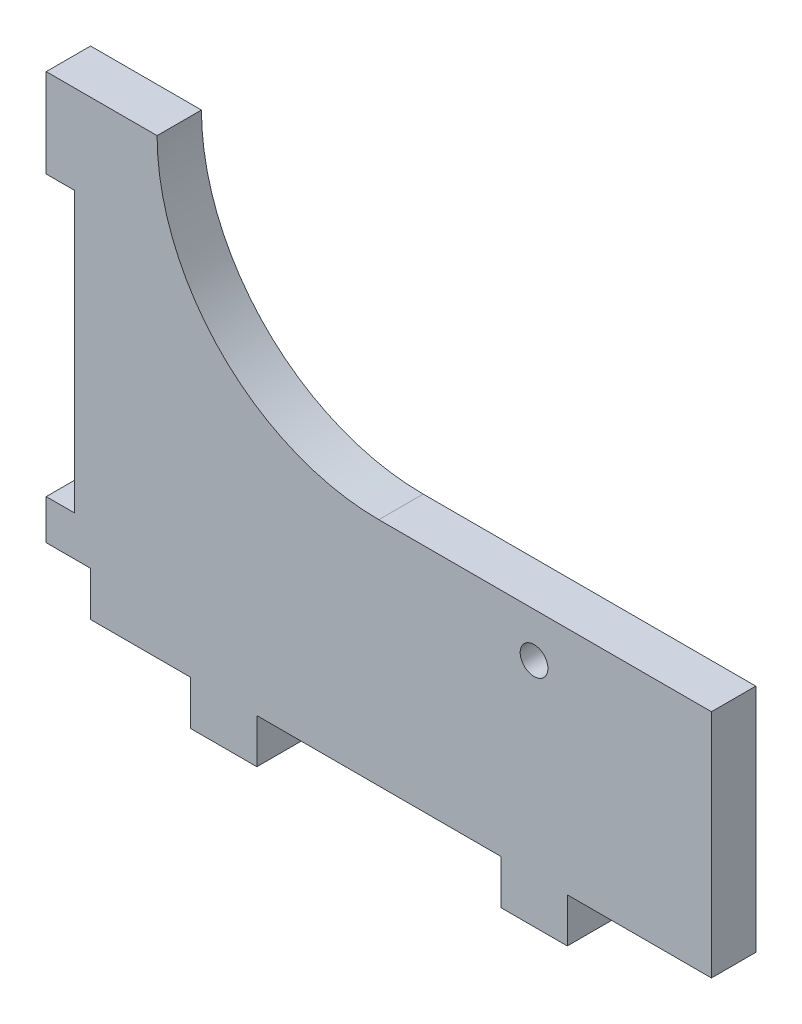
ISO-10303-21;
HEADER;
FILE_DESCRIPTION(('STEP AP214'),'2;1');
FILE_NAME('part.step','',(''),(''),'','','');
FILE_SCHEMA(('AUTOMOTIVE_DESIGN { 1 0 10303 214 1 1 1 1 }'));
ENDSEC;
DATA;
#1=APPLICATION_CONTEXT('core data for automotive mechanical design processes');
#2=APPLICATION_PROTOCOL_DEFINITION('international standard','automotive_design',2000,#1);
#3=PRODUCT_CONTEXT('',#1,'mechanical');
#4=PRODUCT('Part','Part','',(#3));
#5=PRODUCT_RELATED_PRODUCT_CATEGORY('part','',(#4));
#6=PRODUCT_DEFINITION_FORMATION('','',#4);
#7=PRODUCT_DEFINITION_CONTEXT('part definition',#1,'design');
#8=PRODUCT_DEFINITION('design','',#6,#7);
#9=PRODUCT_DEFINITION_SHAPE('','',#8);
#10=(LENGTH_UNIT() NAMED_UNIT(*) SI_UNIT(.MILLI.,.METRE.));
#11=(NAMED_UNIT(*) PLANE_ANGLE_UNIT() SI_UNIT($,.RADIAN.));
#12=(NAMED_UNIT(*) SI_UNIT($,.STERADIAN.) SOLID_ANGLE_UNIT());
#13=UNCERTAINTY_MEASURE_WITH_UNIT(LENGTH_MEASURE(1.E-05),#10,'distance_accuracy_value','');
#14=(GEOMETRIC_REPRESENTATION_CONTEXT(3) GLOBAL_UNCERTAINTY_ASSIGNED_CONTEXT((#13)) GLOBAL_UNIT_ASSIGNED_CONTEXT((#10,
#11,#12)) REPRESENTATION_CONTEXT('',''));
#15=CARTESIAN_POINT('',(0.,0.,0.));
#16=DIRECTION('',(0.,0.,1.));
#17=DIRECTION('',(1.,0.,0.));
#18=AXIS2_PLACEMENT_3D('',#15,#16,#17);
#19=CARTESIAN_POINT('',(-95.25,12.7,12.7));
#20=DIRECTION('',(1.,0.,0.));
#21=DIRECTION('',(0.,0.,-1.));
#22=AXIS2_PLACEMENT_3D('',#19,#20,#21);
#23=PLANE('',#22);
#24=DIRECTION('',(0.,-1.,0.));
#25=VECTOR('',#24,1.);
#26=CARTESIAN_POINT('',(-95.25,12.7,0.));
#27=LINE('',#26,#25);
#28=CARTESIAN_POINT('',(-95.25,142.24,0.));
#29=VERTEX_POINT('',#28);
#30=CARTESIAN_POINT('',(-95.25,116.84,0.));
#31=VERTEX_POINT('',#30);
#32=EDGE_CURVE('E204',#29,#31,#27,.T.);
#33=ORIENTED_EDGE('',*,*,#32,.T.);
#34=DIRECTION('',(0.,0.,1.));
#35=VECTOR('',#34,1.);
#36=CARTESIAN_POINT('',(-95.25,116.84,0.));
#37=LINE('',#36,#35);
#38=CARTESIAN_POINT('',(-95.25,116.84,12.7));
#39=VERTEX_POINT('',#38);
#40=EDGE_CURVE('E325',#31,#39,#37,.T.);
#41=ORIENTED_EDGE('',*,*,#40,.T.);
#42=DIRECTION('',(0.,-1.,0.));
#43=VECTOR('',#42,1.);
#44=CARTESIAN_POINT('',(-95.25,12.7,12.7));
#45=LINE('',#44,#43);
#46=CARTESIAN_POINT('',(-95.25,142.24,12.7));
#47=VERTEX_POINT('',#46);
#48=EDGE_CURVE('E318',#47,#39,#45,.T.);
#49=ORIENTED_EDGE('',*,*,#48,.F.);
#50=DIRECTION('',(0.,0.,-1.));
#51=VECTOR('',#50,1.);
#52=CARTESIAN_POINT('',(-95.25,142.24,12.7));
#53=LINE('',#52,#51);
#54=EDGE_CURVE('E240',#47,#29,#53,.T.);
#55=ORIENTED_EDGE('',*,*,#54,.T.);
#56=EDGE_LOOP('',(#33,#41,#49,#55));
#57=FACE_BOUND('',#56,.T.);
#58=ADVANCED_FACE('F45',(#57),#23,.F.);
#59=CARTESIAN_POINT('',(0.,142.24,12.7));
#60=DIRECTION('',(0.,0.,-1.));
#61=DIRECTION('',(-1.,0.,0.));
#62=AXIS2_PLACEMENT_3D('',#59,#60,#61);
#63=CYLINDRICAL_SURFACE('',#62,63.5);
#64=DIRECTION('',(0.,0.,1.));
#65=VECTOR('',#64,1.);
#66=CARTESIAN_POINT('',(0.,78.74,0.));
#67=LINE('',#66,#65);
#68=CARTESIAN_POINT('',(0.,78.74,0.));
#69=VERTEX_POINT('',#68);
#70=CARTESIAN_POINT('',(0.,78.74,12.7));
#71=VERTEX_POINT('',#70);
#72=EDGE_CURVE('E463',#69,#71,#67,.T.);
#73=ORIENTED_EDGE('',*,*,#72,.F.);
#74=CARTESIAN_POINT('',(0.,142.24,0.));
#75=DIRECTION('',(0.,0.,-1.));
#76=DIRECTION('',(1.,0.,0.));
#77=AXIS2_PLACEMENT_3D('',#74,#75,#76);
#78=CIRCLE('',#77,63.5);
#79=CARTESIAN_POINT('',(-63.5,142.24,0.));
#80=VERTEX_POINT('',#79);
#81=EDGE_CURVE('E236',#69,#80,#78,.T.);
#82=ORIENTED_EDGE('',*,*,#81,.T.);
#83=DIRECTION('',(0.,0.,-1.));
#84=VECTOR('',#83,1.);
#85=CARTESIAN_POINT('',(-63.5,142.24,12.7));
#86=LINE('',#85,#84);
#87=CARTESIAN_POINT('',(-63.5,142.24,12.7));
#88=VERTEX_POINT('',#87);
#89=EDGE_CURVE('E243',#88,#80,#86,.T.);
#90=ORIENTED_EDGE('',*,*,#89,.F.);
#91=CARTESIAN_POINT('',(0.,142.24,12.7));
#92=DIRECTION('',(0.,0.,-1.));
#93=DIRECTION('',(1.,0.,0.));
#94=AXIS2_PLACEMENT_3D('',#91,#92,#93);
#95=CIRCLE('',#94,63.5);
#96=EDGE_CURVE('E307',#71,#88,#95,.T.);
#97=ORIENTED_EDGE('',*,*,#96,.F.);
#98=EDGE_LOOP('',(#73,#82,#90,#97));
#99=FACE_BOUND('',#98,.T.);
#100=ADVANCED_FACE('F375',(#99),#63,.F.);
#101=CARTESIAN_POINT('',(-95.25,36.84,12.7));
#102=VERTEX_POINT('',#101);
#103=CARTESIAN_POINT('',(-95.25,25.4,12.7));
#104=VERTEX_POINT('',#103);
#105=EDGE_CURVE('E197',#102,#104,#45,.T.);
#106=ORIENTED_EDGE('',*,*,#105,.F.);
#107=DIRECTION('',(0.,0.,1.));
#108=VECTOR('',#107,1.);
#109=CARTESIAN_POINT('',(-95.25,36.84,0.));
#110=LINE('',#109,#108);
#111=CARTESIAN_POINT('',(-95.25,36.84,0.));
#112=VERTEX_POINT('',#111);
#113=EDGE_CURVE('E185',#112,#102,#110,.T.);
#114=ORIENTED_EDGE('',*,*,#113,.F.);
#115=CARTESIAN_POINT('',(-95.25,25.4,0.));
#116=VERTEX_POINT('',#115);
#117=EDGE_CURVE('E195',#112,#116,#27,.T.);
#118=ORIENTED_EDGE('',*,*,#117,.T.);
#119=DIRECTION('',(0.,0.,1.));
#120=VECTOR('',#119,1.);
#121=CARTESIAN_POINT('',(-95.25,25.4,0.));
#122=LINE('',#121,#120);
#123=EDGE_CURVE('E354',#116,#104,#122,.T.);
#124=ORIENTED_EDGE('',*,*,#123,.T.);
#125=EDGE_LOOP('',(#106,#114,#118,#124));
#126=FACE_BOUND('',#125,.T.);
#127=ADVANCED_FACE('F47',(#126),#23,.F.);
#128=CARTESIAN_POINT('',(-95.25,12.7,12.7));
#129=DIRECTION('',(0.,1.,0.));
#130=DIRECTION('',(0.,0.,1.));
#131=AXIS2_PLACEMENT_3D('',#128,#129,#130);
#132=PLANE('',#131);
#133=DIRECTION('',(1.,0.,0.));
#134=VECTOR('',#133,1.);
#135=CARTESIAN_POINT('',(-95.25,12.7,12.7));
#136=LINE('',#135,#134);
#137=CARTESIAN_POINT('',(-82.55,12.7,12.7));
#138=VERTEX_POINT('',#137);
#139=CARTESIAN_POINT('',(-53.975,12.7,12.7));
#140=VERTEX_POINT('',#139);
#141=EDGE_CURVE('E326',#138,#140,#136,.T.);
#142=ORIENTED_EDGE('',*,*,#141,.F.);
#143=DIRECTION('',(0.,0.,1.));
#144=VECTOR('',#143,1.);
#145=CARTESIAN_POINT('',(-82.55,12.7,0.));
#146=LINE('',#145,#144);
#147=CARTESIAN_POINT('',(-82.55,12.7,0.));
#148=VERTEX_POINT('',#147);
#149=EDGE_CURVE('E339',#148,#138,#146,.T.);
#150=ORIENTED_EDGE('',*,*,#149,.F.);
#151=DIRECTION('',(1.,0.,0.));
#152=VECTOR('',#151,1.);
#153=CARTESIAN_POINT('',(-95.25,12.7,0.));
#154=LINE('',#153,#152);
#155=CARTESIAN_POINT('',(-53.975,12.7,0.));
#156=VERTEX_POINT('',#155);
#157=EDGE_CURVE('E208',#148,#156,#154,.T.);
#158=ORIENTED_EDGE('',*,*,#157,.T.);
#159=DIRECTION('',(0.,0.,-1.));
#160=VECTOR('',#159,1.);
#161=CARTESIAN_POINT('',(-53.975,12.7,12.7));
#162=LINE('',#161,#160);
#163=EDGE_CURVE('E13',#140,#156,#162,.T.);
#164=ORIENTED_EDGE('',*,*,#163,.F.);
#165=EDGE_LOOP('',(#142,#150,#158,#164));
#166=FACE_BOUND('',#165,.T.);
#167=ADVANCED_FACE('F337',(#166),#132,.F.);
#168=CARTESIAN_POINT('',(-53.975,0.,12.7));
#169=DIRECTION('',(1.,0.,0.));
#170=DIRECTION('',(0.,0.,-1.));
#171=AXIS2_PLACEMENT_3D('',#168,#169,#170);
#172=PLANE('',#171);
#173=DIRECTION('',(0.,-1.,0.));
#174=VECTOR('',#173,1.);
#175=CARTESIAN_POINT('',(-53.975,0.,0.));
#176=LINE('',#175,#174);
#177=CARTESIAN_POINT('',(-53.975,0.,0.));
#178=VERTEX_POINT('',#177);
#179=EDGE_CURVE('E217',#156,#178,#176,.T.);
#180=ORIENTED_EDGE('',*,*,#179,.T.);
#181=DIRECTION('',(0.,0.,-1.));
#182=VECTOR('',#181,1.);
#183=CARTESIAN_POINT('',(-53.975,0.,12.7));
#184=LINE('',#183,#182);
#185=CARTESIAN_POINT('',(-53.975,0.,12.7));
#186=VERTEX_POINT('',#185);
#187=EDGE_CURVE('E53',#186,#178,#184,.T.);
#188=ORIENTED_EDGE('',*,*,#187,.F.);
#189=DIRECTION('',(0.,-1.,0.));
#190=VECTOR('',#189,1.);
#191=CARTESIAN_POINT('',(-53.975,0.,12.7));
#192=LINE('',#191,#190);
#193=EDGE_CURVE('E328',#140,#186,#192,.T.);
#194=ORIENTED_EDGE('',*,*,#193,.F.);
#195=ORIENTED_EDGE('',*,*,#163,.T.);
#196=EDGE_LOOP('',(#180,#188,#194,#195));
#197=FACE_BOUND('',#196,.T.);
#198=ADVANCED_FACE('F335',(#197),#172,.F.);
#199=CARTESIAN_POINT('',(-53.975,0.,12.7));
#200=DIRECTION('',(0.,1.,0.));
#201=DIRECTION('',(0.,0.,1.));
#202=AXIS2_PLACEMENT_3D('',#199,#200,#201);
#203=PLANE('',#202);
#204=DIRECTION('',(1.,0.,0.));
#205=VECTOR('',#204,1.);
#206=CARTESIAN_POINT('',(-53.975,0.,0.));
#207=LINE('',#206,#205);
#208=CARTESIAN_POINT('',(-34.925,0.,0.));
#209=VERTEX_POINT('',#208);
#210=EDGE_CURVE('E219',#178,#209,#207,.T.);
#211=ORIENTED_EDGE('',*,*,#210,.T.);
#212=DIRECTION('',(0.,0.,-1.));
#213=VECTOR('',#212,1.);
#214=CARTESIAN_POINT('',(-34.925,0.,12.7));
#215=LINE('',#214,#213);
#216=CARTESIAN_POINT('',(-34.925,0.,12.7));
#217=VERTEX_POINT('',#216);
#218=EDGE_CURVE('E264',#217,#209,#215,.T.);
#219=ORIENTED_EDGE('',*,*,#218,.F.);
#220=DIRECTION('',(1.,0.,0.));
#221=VECTOR('',#220,1.);
#222=CARTESIAN_POINT('',(-53.975,0.,12.7));
#223=LINE('',#222,#221);
#224=EDGE_CURVE('E273',#186,#217,#223,.T.);
#225=ORIENTED_EDGE('',*,*,#224,.F.);
#226=ORIENTED_EDGE('',*,*,#187,.T.);
#227=EDGE_LOOP('',(#211,#219,#225,#226));
#228=FACE_BOUND('',#227,.T.);
#229=ADVANCED_FACE('F271',(#228),#203,.F.);
#230=CARTESIAN_POINT('',(-34.925,0.,12.7));
#231=DIRECTION('',(-1.,0.,0.));
#232=DIRECTION('',(0.,0.,1.));
#233=AXIS2_PLACEMENT_3D('',#230,#231,#232);
#234=PLANE('',#233);
#235=DIRECTION('',(0.,1.,0.));
#236=VECTOR('',#235,1.);
#237=CARTESIAN_POINT('',(-34.925,0.,0.));
#238=LINE('',#237,#236);
#239=CARTESIAN_POINT('',(-34.925,12.7,0.));
#240=VERTEX_POINT('',#239);
#241=EDGE_CURVE('E221',#209,#240,#238,.T.);
#242=ORIENTED_EDGE('',*,*,#241,.T.);
#243=DIRECTION('',(0.,0.,-1.));
#244=VECTOR('',#243,1.);
#245=CARTESIAN_POINT('',(-34.925,12.7,12.7));
#246=LINE('',#245,#244);
#247=CARTESIAN_POINT('',(-34.925,12.7,12.7));
#248=VERTEX_POINT('',#247);
#249=EDGE_CURVE('E261',#248,#240,#246,.T.);
#250=ORIENTED_EDGE('',*,*,#249,.F.);
#251=DIRECTION('',(0.,1.,0.));
#252=VECTOR('',#251,1.);
#253=CARTESIAN_POINT('',(-34.925,0.,12.7));
#254=LINE('',#253,#252);
#255=EDGE_CURVE('E293',#217,#248,#254,.T.);
#256=ORIENTED_EDGE('',*,*,#255,.F.);
#257=ORIENTED_EDGE('',*,*,#218,.T.);
#258=EDGE_LOOP('',(#242,#250,#256,#257));
#259=FACE_BOUND('',#258,.T.);
#260=ADVANCED_FACE('F283',(#259),#234,.F.);
#261=CARTESIAN_POINT('',(-34.925,12.7,12.7));
#262=DIRECTION('',(0.,1.,0.));
#263=DIRECTION('',(0.,0.,1.));
#264=AXIS2_PLACEMENT_3D('',#261,#262,#263);
#265=PLANE('',#264);
#266=DIRECTION('',(1.,0.,0.));
#267=VECTOR('',#266,1.);
#268=CARTESIAN_POINT('',(-34.925,12.7,0.));
#269=LINE('',#268,#267);
#270=CARTESIAN_POINT('',(34.925,12.7,0.));
#271=VERTEX_POINT('',#270);
#272=EDGE_CURVE('E223',#240,#271,#269,.T.);
#273=ORIENTED_EDGE('',*,*,#272,.T.);
#274=DIRECTION('',(0.,0.,-1.));
#275=VECTOR('',#274,1.);
#276=CARTESIAN_POINT('',(34.925,12.7,12.7));
#277=LINE('',#276,#275);
#278=CARTESIAN_POINT('',(34.925,12.7,12.7));
#279=VERTEX_POINT('',#278);
#280=EDGE_CURVE('E258',#279,#271,#277,.T.);
#281=ORIENTED_EDGE('',*,*,#280,.F.);
#282=DIRECTION('',(1.,0.,0.));
#283=VECTOR('',#282,1.);
#284=CARTESIAN_POINT('',(-34.925,12.7,12.7));
#285=LINE('',#284,#283);
#286=EDGE_CURVE('E289',#248,#279,#285,.T.);
#287=ORIENTED_EDGE('',*,*,#286,.F.);
#288=ORIENTED_EDGE('',*,*,#249,.T.);
#289=EDGE_LOOP('',(#273,#281,#287,#288));
#290=FACE_BOUND('',#289,.T.);
#291=ADVANCED_FACE('F287',(#290),#265,.F.);
#292=CARTESIAN_POINT('',(34.925,0.,12.7));
#293=DIRECTION('',(1.,0.,0.));
#294=DIRECTION('',(0.,0.,-1.));
#295=AXIS2_PLACEMENT_3D('',#292,#293,#294);
#296=PLANE('',#295);
#297=DIRECTION('',(0.,-1.,0.));
#298=VECTOR('',#297,1.);
#299=CARTESIAN_POINT('',(34.925,0.,0.));
#300=LINE('',#299,#298);
#301=CARTESIAN_POINT('',(34.925,0.,0.));
#302=VERTEX_POINT('',#301);
#303=EDGE_CURVE('E225',#271,#302,#300,.T.);
#304=ORIENTED_EDGE('',*,*,#303,.T.);
#305=DIRECTION('',(0.,0.,-1.));
#306=VECTOR('',#305,1.);
#307=CARTESIAN_POINT('',(34.925,0.,12.7));
#308=LINE('',#307,#306);
#309=CARTESIAN_POINT('',(34.925,0.,12.7));
#310=VERTEX_POINT('',#309);
#311=EDGE_CURVE('E255',#310,#302,#308,.T.);
#312=ORIENTED_EDGE('',*,*,#311,.F.);
#313=DIRECTION('',(0.,-1.,0.));
#314=VECTOR('',#313,1.);
#315=CARTESIAN_POINT('',(34.925,0.,12.7));
#316=LINE('',#315,#314);
#317=EDGE_CURVE('E292',#279,#310,#316,.T.);
#318=ORIENTED_EDGE('',*,*,#317,.F.);
#319=ORIENTED_EDGE('',*,*,#280,.T.);
#320=EDGE_LOOP('',(#304,#312,#318,#319));
#321=FACE_BOUND('',#320,.T.);
#322=ADVANCED_FACE('F398',(#321),#296,.F.);
#323=CARTESIAN_POINT('',(34.925,0.,12.7));
#324=DIRECTION('',(0.,1.,0.));
#325=DIRECTION('',(0.,0.,1.));
#326=AXIS2_PLACEMENT_3D('',#323,#324,#325);
#327=PLANE('',#326);
#328=DIRECTION('',(1.,0.,0.));
#329=VECTOR('',#328,1.);
#330=CARTESIAN_POINT('',(34.925,0.,0.));
#331=LINE('',#330,#329);
#332=CARTESIAN_POINT('',(53.975,0.,0.));
#333=VERTEX_POINT('',#332);
#334=EDGE_CURVE('E227',#302,#333,#331,.T.);
#335=ORIENTED_EDGE('',*,*,#334,.T.);
#336=DIRECTION('',(0.,0.,-1.));
#337=VECTOR('',#336,1.);
#338=CARTESIAN_POINT('',(53.975,0.,12.7));
#339=LINE('',#338,#337);
#340=CARTESIAN_POINT('',(53.975,0.,12.7));
#341=VERTEX_POINT('',#340);
#342=EDGE_CURVE('E252',#341,#333,#339,.T.);
#343=ORIENTED_EDGE('',*,*,#342,.F.);
#344=DIRECTION('',(1.,0.,0.));
#345=VECTOR('',#344,1.);
#346=CARTESIAN_POINT('',(34.925,0.,12.7));
#347=LINE('',#346,#345);
#348=EDGE_CURVE('E295',#310,#341,#347,.T.);
#349=ORIENTED_EDGE('',*,*,#348,.F.);
#350=ORIENTED_EDGE('',*,*,#311,.T.);
#351=EDGE_LOOP('',(#335,#343,#349,#350));
#352=FACE_BOUND('',#351,.T.);
#353=ADVANCED_FACE('F401',(#352),#327,.F.);
#354=CARTESIAN_POINT('',(53.975,0.,12.7));
#355=DIRECTION('',(-1.,0.,0.));
#356=DIRECTION('',(0.,0.,1.));
#357=AXIS2_PLACEMENT_3D('',#354,#355,#356);
#358=PLANE('',#357);
#359=DIRECTION('',(0.,1.,0.));
#360=VECTOR('',#359,1.);
#361=CARTESIAN_POINT('',(53.975,0.,0.));
#362=LINE('',#361,#360);
#363=CARTESIAN_POINT('',(53.975,12.7,0.));
#364=VERTEX_POINT('',#363);
#365=EDGE_CURVE('E229',#333,#364,#362,.T.);
#366=ORIENTED_EDGE('',*,*,#365,.T.);
#367=DIRECTION('',(0.,0.,-1.));
#368=VECTOR('',#367,1.);
#369=CARTESIAN_POINT('',(53.975,12.7,12.7));
#370=LINE('',#369,#368);
#371=CARTESIAN_POINT('',(53.975,12.7,12.7));
#372=VERTEX_POINT('',#371);
#373=EDGE_CURVE('E249',#372,#364,#370,.T.);
#374=ORIENTED_EDGE('',*,*,#373,.F.);
#375=DIRECTION('',(0.,1.,0.));
#376=VECTOR('',#375,1.);
#377=CARTESIAN_POINT('',(53.975,0.,12.7));
#378=LINE('',#377,#376);
#379=EDGE_CURVE('E301',#341,#372,#378,.T.);
#380=ORIENTED_EDGE('',*,*,#379,.F.);
#381=ORIENTED_EDGE('',*,*,#342,.T.);
#382=EDGE_LOOP('',(#366,#374,#380,#381));
#383=FACE_BOUND('',#382,.T.);
#384=ADVANCED_FACE('F405',(#383),#358,.F.);
#385=CARTESIAN_POINT('',(53.975,12.7,12.7));
#386=DIRECTION('',(0.,1.,0.));
#387=DIRECTION('',(0.,0.,1.));
#388=AXIS2_PLACEMENT_3D('',#385,#386,#387);
#389=PLANE('',#388);
#390=DIRECTION('',(1.,0.,0.));
#391=VECTOR('',#390,1.);
#392=CARTESIAN_POINT('',(53.975,12.7,0.));
#393=LINE('',#392,#391);
#394=CARTESIAN_POINT('',(95.25,12.7,0.));
#395=VERTEX_POINT('',#394);
#396=EDGE_CURVE('E231',#364,#395,#393,.T.);
#397=ORIENTED_EDGE('',*,*,#396,.T.);
#398=DIRECTION('',(0.,0.,-1.));
#399=VECTOR('',#398,1.);
#400=CARTESIAN_POINT('',(95.25,12.7,12.7));
#401=LINE('',#400,#399);
#402=CARTESIAN_POINT('',(95.25,12.7,12.7));
#403=VERTEX_POINT('',#402);
#404=EDGE_CURVE('E246',#403,#395,#401,.T.);
#405=ORIENTED_EDGE('',*,*,#404,.F.);
#406=DIRECTION('',(1.,0.,0.));
#407=VECTOR('',#406,1.);
#408=CARTESIAN_POINT('',(53.975,12.7,12.7));
#409=LINE('',#408,#407);
#410=EDGE_CURVE('E303',#372,#403,#409,.T.);
#411=ORIENTED_EDGE('',*,*,#410,.F.);
#412=ORIENTED_EDGE('',*,*,#373,.T.);
#413=EDGE_LOOP('',(#397,#405,#411,#412));
#414=FACE_BOUND('',#413,.T.);
#415=ADVANCED_FACE('F409',(#414),#389,.F.);
#416=CARTESIAN_POINT('',(95.25,12.7,12.7));
#417=DIRECTION('',(-1.,0.,0.));
#418=DIRECTION('',(0.,0.,1.));
#419=AXIS2_PLACEMENT_3D('',#416,#417,#418);
#420=PLANE('',#419);
#421=DIRECTION('',(0.,1.,0.));
#422=VECTOR('',#421,1.);
#423=CARTESIAN_POINT('',(95.25,12.7,0.));
#424=LINE('',#423,#422);
#425=CARTESIAN_POINT('',(95.25,78.74,0.));
#426=VERTEX_POINT('',#425);
#427=EDGE_CURVE('E233',#395,#426,#424,.T.);
#428=ORIENTED_EDGE('',*,*,#427,.T.);
#429=DIRECTION('',(0.,0.,1.));
#430=VECTOR('',#429,1.);
#431=CARTESIAN_POINT('',(95.25,78.74,12.7));
#432=LINE('',#431,#430);
#433=CARTESIAN_POINT('',(95.25,78.74,12.7));
#434=VERTEX_POINT('',#433);
#435=EDGE_CURVE('E68',#426,#434,#432,.T.);
#436=ORIENTED_EDGE('',*,*,#435,.T.);
#437=DIRECTION('',(0.,1.,0.));
#438=VECTOR('',#437,1.);
#439=CARTESIAN_POINT('',(95.25,12.7,12.7));
#440=LINE('',#439,#438);
#441=EDGE_CURVE('E305',#403,#434,#440,.T.);
#442=ORIENTED_EDGE('',*,*,#441,.F.);
#443=ORIENTED_EDGE('',*,*,#404,.T.);
#444=EDGE_LOOP('',(#428,#436,#442,#443));
#445=FACE_BOUND('',#444,.T.);
#446=ADVANCED_FACE('F413',(#445),#420,.F.);
#447=CARTESIAN_POINT('',(-95.25,142.24,12.7));
#448=DIRECTION('',(0.,-1.,0.));
#449=DIRECTION('',(0.,0.,-1.));
#450=AXIS2_PLACEMENT_3D('',#447,#448,#449);
#451=PLANE('',#450);
#452=DIRECTION('',(-1.,0.,0.));
#453=VECTOR('',#452,1.);
#454=CARTESIAN_POINT('',(-95.25,142.24,0.));
#455=LINE('',#454,#453);
#456=EDGE_CURVE('E238',#80,#29,#455,.T.);
#457=ORIENTED_EDGE('',*,*,#456,.T.);
#458=ORIENTED_EDGE('',*,*,#54,.F.);
#459=DIRECTION('',(-1.,0.,0.));
#460=VECTOR('',#459,1.);
#461=CARTESIAN_POINT('',(-95.25,142.24,12.7));
#462=LINE('',#461,#460);
#463=EDGE_CURVE('E214',#88,#47,#462,.T.);
#464=ORIENTED_EDGE('',*,*,#463,.F.);
#465=ORIENTED_EDGE('',*,*,#89,.T.);
#466=EDGE_LOOP('',(#457,#458,#464,#465));
#467=FACE_BOUND('',#466,.T.);
#468=ADVANCED_FACE('F320',(#467),#451,.F.);
#469=CARTESIAN_POINT('',(0.,142.24,12.7));
#470=DIRECTION('',(0.,0.,1.));
#471=DIRECTION('',(1.,0.,0.));
#472=AXIS2_PLACEMENT_3D('',#469,#470,#471);
#473=PLANE('',#472);
#474=DIRECTION('',(-1.,0.,0.));
#475=VECTOR('',#474,1.);
#476=CARTESIAN_POINT('',(-95.25,116.84,12.7));
#477=LINE('',#476,#475);
#478=CARTESIAN_POINT('',(-87.1749843110526,116.84,12.7));
#479=VERTEX_POINT('',#478);
#480=EDGE_CURVE('E190',#479,#39,#477,.T.);
#481=ORIENTED_EDGE('',*,*,#480,.F.);
#482=DIRECTION('',(0.,1.,0.));
#483=VECTOR('',#482,1.);
#484=CARTESIAN_POINT('',(-87.1749843110526,116.84,12.7));
#485=LINE('',#484,#483);
#486=CARTESIAN_POINT('',(-87.1749843110526,36.84,12.7));
#487=VERTEX_POINT('',#486);
#488=EDGE_CURVE('E475',#487,#479,#485,.T.);
#489=ORIENTED_EDGE('',*,*,#488,.F.);
#490=DIRECTION('',(1.,0.,0.));
#491=VECTOR('',#490,1.);
#492=CARTESIAN_POINT('',(-87.1749843110526,36.84,12.7));
#493=LINE('',#492,#491);
#494=EDGE_CURVE('E473',#102,#487,#493,.T.);
#495=ORIENTED_EDGE('',*,*,#494,.F.);
#496=ORIENTED_EDGE('',*,*,#105,.T.);
#497=DIRECTION('',(-1.,0.,0.));
#498=VECTOR('',#497,1.);
#499=CARTESIAN_POINT('',(-95.25,25.4,12.7));
#500=LINE('',#499,#498);
#501=CARTESIAN_POINT('',(-82.55,25.4,12.7));
#502=VERTEX_POINT('',#501);
#503=EDGE_CURVE('E343',#502,#104,#500,.T.);
#504=ORIENTED_EDGE('',*,*,#503,.F.);
#505=DIRECTION('',(0.,1.,0.));
#506=VECTOR('',#505,1.);
#507=CARTESIAN_POINT('',(-82.55,12.7,12.7));
#508=LINE('',#507,#506);
#509=EDGE_CURVE('E347',#138,#502,#508,.T.);
#510=ORIENTED_EDGE('',*,*,#509,.F.);
#511=ORIENTED_EDGE('',*,*,#141,.T.);
#512=ORIENTED_EDGE('',*,*,#193,.T.);
#513=ORIENTED_EDGE('',*,*,#224,.T.);
#514=ORIENTED_EDGE('',*,*,#255,.T.);
#515=ORIENTED_EDGE('',*,*,#286,.T.);
#516=ORIENTED_EDGE('',*,*,#317,.T.);
#517=ORIENTED_EDGE('',*,*,#348,.T.);
#518=ORIENTED_EDGE('',*,*,#379,.T.);
#519=ORIENTED_EDGE('',*,*,#410,.T.);
#520=ORIENTED_EDGE('',*,*,#441,.T.);
#521=DIRECTION('',(1.,0.,0.));
#522=VECTOR('',#521,1.);
#523=CARTESIAN_POINT('',(0.,78.74,12.7));
#524=LINE('',#523,#522);
#525=EDGE_CURVE('E466',#71,#434,#524,.T.);
#526=ORIENTED_EDGE('',*,*,#525,.F.);
#527=ORIENTED_EDGE('',*,*,#96,.T.);
#528=ORIENTED_EDGE('',*,*,#463,.T.);
#529=ORIENTED_EDGE('',*,*,#48,.T.);
#530=EDGE_LOOP('',(#481,#489,#495,#496,#504,#510,#511,#512,#513,#514,#515,#516,#517,#518,#519,
#520,#526,#527,#528,#529));
#531=FACE_BOUND('',#530,.T.);
#532=CARTESIAN_POINT('',(44.45,66.04,12.7));
#533=DIRECTION('',(0.,0.,1.));
#534=DIRECTION('',(1.,0.,0.));
#535=AXIS2_PLACEMENT_3D('',#532,#533,#534);
#536=CIRCLE('',#535,3.96874999999998);
#537=CARTESIAN_POINT('',(48.41875,66.04,12.7));
#538=VERTEX_POINT('',#537);
#539=EDGE_CURVE('E210',#538,#538,#536,.T.);
#540=ORIENTED_EDGE('',*,*,#539,.F.);
#541=EDGE_LOOP('',(#540));
#542=FACE_BOUND('',#541,.T.);
#543=ADVANCED_FACE('F315',(#531,#542),#473,.T.);
#544=CARTESIAN_POINT('',(0.,142.24,0.));
#545=DIRECTION('',(0.,0.,1.));
#546=DIRECTION('',(1.,0.,0.));
#547=AXIS2_PLACEMENT_3D('',#544,#545,#546);
#548=PLANE('',#547);
#549=CARTESIAN_POINT('',(44.45,66.04,0.));
#550=DIRECTION('',(0.,0.,1.));
#551=DIRECTION('',(1.,0.,0.));
#552=AXIS2_PLACEMENT_3D('',#549,#550,#551);
#553=CIRCLE('',#552,3.96874999999998);
#554=CARTESIAN_POINT('',(48.41875,66.04,0.));
#555=VERTEX_POINT('',#554);
#556=EDGE_CURVE('E205',#555,#555,#553,.T.);
#557=ORIENTED_EDGE('',*,*,#556,.T.);
#558=EDGE_LOOP('',(#557));
#559=FACE_BOUND('',#558,.T.);
#560=DIRECTION('',(0.,1.,0.));
#561=VECTOR('',#560,1.);
#562=CARTESIAN_POINT('',(-87.1749843110526,116.84,0.));
#563=LINE('',#562,#561);
#564=CARTESIAN_POINT('',(-87.1749843110526,36.84,0.));
#565=VERTEX_POINT('',#564);
#566=CARTESIAN_POINT('',(-87.1749843110526,116.84,0.));
#567=VERTEX_POINT('',#566);
#568=EDGE_CURVE('E60',#565,#567,#563,.T.);
#569=ORIENTED_EDGE('',*,*,#568,.T.);
#570=DIRECTION('',(-1.,0.,0.));
#571=VECTOR('',#570,1.);
#572=CARTESIAN_POINT('',(-95.25,116.84,0.));
#573=LINE('',#572,#571);
#574=EDGE_CURVE('E198',#567,#31,#573,.T.);
#575=ORIENTED_EDGE('',*,*,#574,.T.);
#576=ORIENTED_EDGE('',*,*,#32,.F.);
#577=ORIENTED_EDGE('',*,*,#456,.F.);
#578=ORIENTED_EDGE('',*,*,#81,.F.);
#579=DIRECTION('',(1.,0.,0.));
#580=VECTOR('',#579,1.);
#581=CARTESIAN_POINT('',(0.,78.74,0.));
#582=LINE('',#581,#580);
#583=EDGE_CURVE('E461',#69,#426,#582,.T.);
#584=ORIENTED_EDGE('',*,*,#583,.T.);
#585=ORIENTED_EDGE('',*,*,#427,.F.);
#586=ORIENTED_EDGE('',*,*,#396,.F.);
#587=ORIENTED_EDGE('',*,*,#365,.F.);
#588=ORIENTED_EDGE('',*,*,#334,.F.);
#589=ORIENTED_EDGE('',*,*,#303,.F.);
#590=ORIENTED_EDGE('',*,*,#272,.F.);
#591=ORIENTED_EDGE('',*,*,#241,.F.);
#592=ORIENTED_EDGE('',*,*,#210,.F.);
#593=ORIENTED_EDGE('',*,*,#179,.F.);
#594=ORIENTED_EDGE('',*,*,#157,.F.);
#595=DIRECTION('',(0.,1.,0.));
#596=VECTOR('',#595,1.);
#597=CARTESIAN_POINT('',(-82.55,12.7,0.));
#598=LINE('',#597,#596);
#599=CARTESIAN_POINT('',(-82.55,25.4,0.));
#600=VERTEX_POINT('',#599);
#601=EDGE_CURVE('E340',#148,#600,#598,.T.);
#602=ORIENTED_EDGE('',*,*,#601,.T.);
#603=DIRECTION('',(-1.,0.,0.));
#604=VECTOR('',#603,1.);
#605=CARTESIAN_POINT('',(-95.25,25.4,0.));
#606=LINE('',#605,#604);
#607=EDGE_CURVE('E203',#600,#116,#606,.T.);
#608=ORIENTED_EDGE('',*,*,#607,.T.);
#609=ORIENTED_EDGE('',*,*,#117,.F.);
#610=DIRECTION('',(1.,0.,0.));
#611=VECTOR('',#610,1.);
#612=CARTESIAN_POINT('',(-87.1749843110526,36.84,0.));
#613=LINE('',#612,#611);
#614=EDGE_CURVE('E181',#112,#565,#613,.T.);
#615=ORIENTED_EDGE('',*,*,#614,.T.);
#616=EDGE_LOOP('',(#569,#575,#576,#577,#578,#584,#585,#586,#587,#588,#589,#590,#591,#592,#593,
#594,#602,#608,#609,#615));
#617=FACE_BOUND('',#616,.T.);
#618=ADVANCED_FACE('F201',(#559,#617),#548,.F.);
#619=CARTESIAN_POINT('',(44.45,66.04,0.));
#620=DIRECTION('',(0.,0.,1.));
#621=DIRECTION('',(1.,0.,0.));
#622=AXIS2_PLACEMENT_3D('',#619,#620,#621);
#623=CYLINDRICAL_SURFACE('',#622,3.96874999999998);
#624=ORIENTED_EDGE('',*,*,#556,.F.);
#625=EDGE_LOOP('',(#624));
#626=FACE_BOUND('',#625,.T.);
#627=ORIENTED_EDGE('',*,*,#539,.T.);
#628=EDGE_LOOP('',(#627));
#629=FACE_BOUND('',#628,.T.);
#630=ADVANCED_FACE('F363',(#626,#629),#623,.F.);
#631=CARTESIAN_POINT('',(-95.25,25.4,0.));
#632=DIRECTION('',(0.,1.,0.));
#633=DIRECTION('',(0.,0.,1.));
#634=AXIS2_PLACEMENT_3D('',#631,#632,#633);
#635=PLANE('',#634);
#636=ORIENTED_EDGE('',*,*,#503,.T.);
#637=ORIENTED_EDGE('',*,*,#123,.F.);
#638=ORIENTED_EDGE('',*,*,#607,.F.);
#639=DIRECTION('',(0.,0.,1.));
#640=VECTOR('',#639,1.);
#641=CARTESIAN_POINT('',(-82.55,25.4,0.));
#642=LINE('',#641,#640);
#643=EDGE_CURVE('E356',#600,#502,#642,.T.);
#644=ORIENTED_EDGE('',*,*,#643,.T.);
#645=EDGE_LOOP('',(#636,#637,#638,#644));
#646=FACE_BOUND('',#645,.T.);
#647=ADVANCED_FACE('F361',(#646),#635,.F.);
#648=CARTESIAN_POINT('',(-82.55,12.7,0.));
#649=DIRECTION('',(1.,0.,0.));
#650=DIRECTION('',(0.,0.,-1.));
#651=AXIS2_PLACEMENT_3D('',#648,#649,#650);
#652=PLANE('',#651);
#653=ORIENTED_EDGE('',*,*,#509,.T.);
#654=ORIENTED_EDGE('',*,*,#643,.F.);
#655=ORIENTED_EDGE('',*,*,#601,.F.);
#656=ORIENTED_EDGE('',*,*,#149,.T.);
#657=EDGE_LOOP('',(#653,#654,#655,#656));
#658=FACE_BOUND('',#657,.T.);
#659=ADVANCED_FACE('F358',(#658),#652,.F.);
#660=CARTESIAN_POINT('',(0.,78.74,0.));
#661=DIRECTION('',(0.,-1.,0.));
#662=DIRECTION('',(0.,0.,-1.));
#663=AXIS2_PLACEMENT_3D('',#660,#661,#662);
#664=PLANE('',#663);
#665=ORIENTED_EDGE('',*,*,#583,.F.);
#666=ORIENTED_EDGE('',*,*,#72,.T.);
#667=ORIENTED_EDGE('',*,*,#525,.T.);
#668=ORIENTED_EDGE('',*,*,#435,.F.);
#669=EDGE_LOOP('',(#665,#666,#667,#668));
#670=FACE_BOUND('',#669,.T.);
#671=ADVANCED_FACE('F369',(#670),#664,.F.);
#672=CARTESIAN_POINT('',(-95.25,116.84,0.));
#673=DIRECTION('',(0.,1.,0.));
#674=DIRECTION('',(0.,0.,1.));
#675=AXIS2_PLACEMENT_3D('',#672,#673,#674);
#676=PLANE('',#675);
#677=ORIENTED_EDGE('',*,*,#480,.T.);
#678=ORIENTED_EDGE('',*,*,#40,.F.);
#679=ORIENTED_EDGE('',*,*,#574,.F.);
#680=DIRECTION('',(0.,0.,1.));
#681=VECTOR('',#680,1.);
#682=CARTESIAN_POINT('',(-87.1749843110526,116.84,0.));
#683=LINE('',#682,#681);
#684=EDGE_CURVE('E480',#567,#479,#683,.T.);
#685=ORIENTED_EDGE('',*,*,#684,.T.);
#686=EDGE_LOOP('',(#677,#678,#679,#685));
#687=FACE_BOUND('',#686,.T.);
#688=ADVANCED_FACE('F432',(#687),#676,.F.);
#689=CARTESIAN_POINT('',(-87.1749843110526,116.84,0.));
#690=DIRECTION('',(1.,0.,0.));
#691=DIRECTION('',(0.,0.,-1.));
#692=AXIS2_PLACEMENT_3D('',#689,#690,#691);
#693=PLANE('',#692);
#694=ORIENTED_EDGE('',*,*,#488,.T.);
#695=ORIENTED_EDGE('',*,*,#684,.F.);
#696=ORIENTED_EDGE('',*,*,#568,.F.);
#697=DIRECTION('',(0.,0.,1.));
#698=VECTOR('',#697,1.);
#699=CARTESIAN_POINT('',(-87.1749843110526,36.84,0.));
#700=LINE('',#699,#698);
#701=EDGE_CURVE('E187',#565,#487,#700,.T.);
#702=ORIENTED_EDGE('',*,*,#701,.T.);
#703=EDGE_LOOP('',(#694,#695,#696,#702));
#704=FACE_BOUND('',#703,.T.);
#705=ADVANCED_FACE('F437',(#704),#693,.F.);
#706=CARTESIAN_POINT('',(-87.1749843110526,36.84,0.));
#707=DIRECTION('',(0.,-1.,0.));
#708=DIRECTION('',(0.,0.,-1.));
#709=AXIS2_PLACEMENT_3D('',#706,#707,#708);
#710=PLANE('',#709);
#711=ORIENTED_EDGE('',*,*,#494,.T.);
#712=ORIENTED_EDGE('',*,*,#701,.F.);
#713=ORIENTED_EDGE('',*,*,#614,.F.);
#714=ORIENTED_EDGE('',*,*,#113,.T.);
#715=EDGE_LOOP('',(#711,#712,#713,#714));
#716=FACE_BOUND('',#715,.T.);
#717=ADVANCED_FACE('F184',(#716),#710,.F.);
#718=CLOSED_SHELL('',(#58,#100,#127,#167,#198,#229,#260,#291,#322,#353,#384,#415,#446,#468,#543,
#618,#630,#647,#659,#671,#688,#705,#717));
#719=MANIFOLD_SOLID_BREP('B2',#718);
#720=ADVANCED_BREP_SHAPE_REPRESENTATION('',(#18,#719),#14);
#721=SHAPE_DEFINITION_REPRESENTATION(#9,#720);
ENDSEC;
END-ISO-10303-21;
